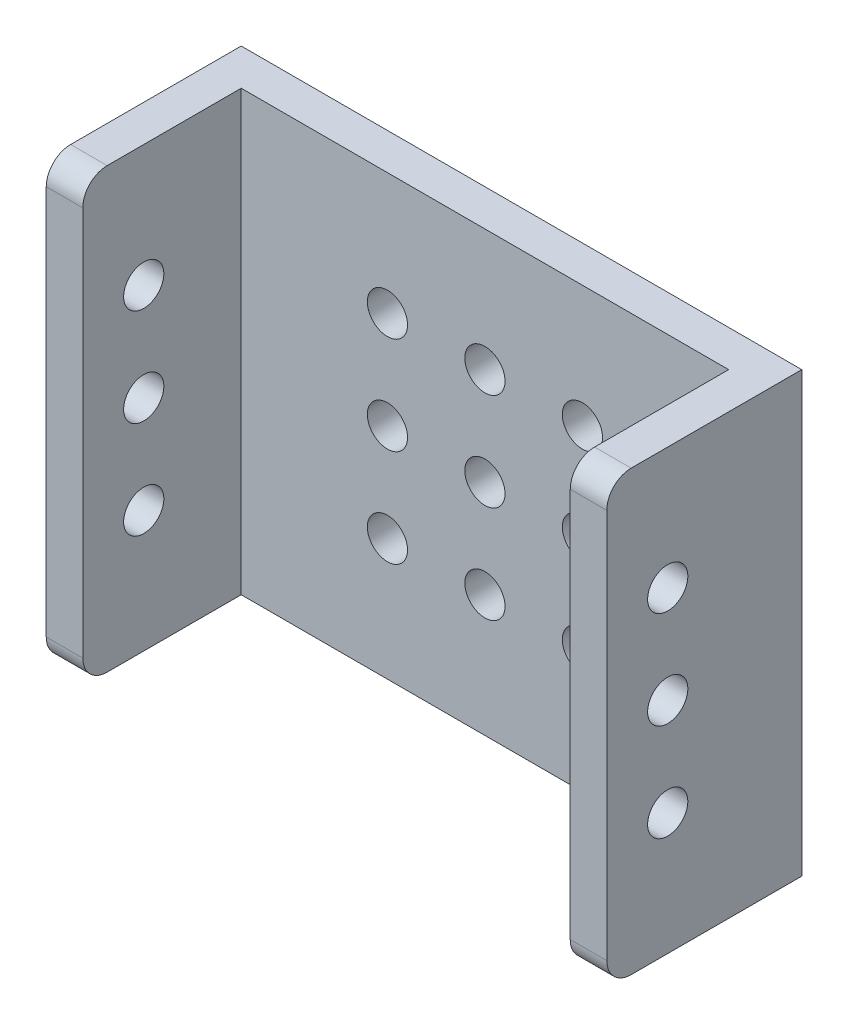
ISO-10303-21;
HEADER;
FILE_DESCRIPTION(('STEP AP214'),'2;1');
FILE_NAME('part.step','',(''),(''),'','','');
FILE_SCHEMA(('AUTOMOTIVE_DESIGN { 1 0 10303 214 1 1 1 1 }'));
ENDSEC;
DATA;
#1=APPLICATION_CONTEXT('core data for automotive mechanical design processes');
#2=APPLICATION_PROTOCOL_DEFINITION('international standard','automotive_design',2000,#1);
#3=PRODUCT_CONTEXT('',#1,'mechanical');
#4=PRODUCT('Part','Part','',(#3));
#5=PRODUCT_RELATED_PRODUCT_CATEGORY('part','',(#4));
#6=PRODUCT_DEFINITION_FORMATION('','',#4);
#7=PRODUCT_DEFINITION_CONTEXT('part definition',#1,'design');
#8=PRODUCT_DEFINITION('design','',#6,#7);
#9=PRODUCT_DEFINITION_SHAPE('','',#8);
#10=(LENGTH_UNIT() NAMED_UNIT(*) SI_UNIT(.MILLI.,.METRE.));
#11=(NAMED_UNIT(*) PLANE_ANGLE_UNIT() SI_UNIT($,.RADIAN.));
#12=(NAMED_UNIT(*) SI_UNIT($,.STERADIAN.) SOLID_ANGLE_UNIT());
#13=UNCERTAINTY_MEASURE_WITH_UNIT(LENGTH_MEASURE(1.E-05),#10,'distance_accuracy_value','');
#14=(GEOMETRIC_REPRESENTATION_CONTEXT(3) GLOBAL_UNCERTAINTY_ASSIGNED_CONTEXT((#13)) GLOBAL_UNIT_ASSIGNED_CONTEXT((#10,
#11,#12)) REPRESENTATION_CONTEXT('',''));
#15=CARTESIAN_POINT('',(0.,0.,0.));
#16=DIRECTION('',(0.,0.,1.));
#17=DIRECTION('',(1.,0.,0.));
#18=AXIS2_PLACEMENT_3D('',#15,#16,#17);
#19=CARTESIAN_POINT('',(0.,0.,3.));
#20=DIRECTION('',(0.,0.,1.));
#21=DIRECTION('',(1.,0.,0.));
#22=AXIS2_PLACEMENT_3D('',#19,#20,#21);
#23=PLANE('',#22);
#24=CARTESIAN_POINT('',(23.,26.,3.));
#25=DIRECTION('',(0.,0.,1.));
#26=DIRECTION('',(1.,0.,0.));
#27=AXIS2_PLACEMENT_3D('',#24,#25,#26);
#28=CIRCLE('',#27,1.65);
#29=CARTESIAN_POINT('',(24.65,26.,3.));
#30=VERTEX_POINT('',#29);
#31=EDGE_CURVE('E210',#30,#30,#28,.T.);
#32=ORIENTED_EDGE('',*,*,#31,.F.);
#33=EDGE_LOOP('',(#32));
#34=FACE_BOUND('',#33,.T.);
#35=CARTESIAN_POINT('',(31.,18.,3.));
#36=DIRECTION('',(0.,0.,1.));
#37=DIRECTION('',(1.,0.,0.));
#38=AXIS2_PLACEMENT_3D('',#35,#36,#37);
#39=CIRCLE('',#38,1.65);
#40=CARTESIAN_POINT('',(32.65,18.,3.));
#41=VERTEX_POINT('',#40);
#42=EDGE_CURVE('E285',#41,#41,#39,.T.);
#43=ORIENTED_EDGE('',*,*,#42,.F.);
#44=EDGE_LOOP('',(#43));
#45=FACE_BOUND('',#44,.T.);
#46=CARTESIAN_POINT('',(23.,10.,3.));
#47=DIRECTION('',(0.,0.,1.));
#48=DIRECTION('',(1.,0.,0.));
#49=AXIS2_PLACEMENT_3D('',#46,#47,#48);
#50=CIRCLE('',#49,1.65);
#51=CARTESIAN_POINT('',(24.65,10.,3.));
#52=VERTEX_POINT('',#51);
#53=EDGE_CURVE('E288',#52,#52,#50,.T.);
#54=ORIENTED_EDGE('',*,*,#53,.F.);
#55=EDGE_LOOP('',(#54));
#56=FACE_BOUND('',#55,.T.);
#57=CARTESIAN_POINT('',(15.,18.,3.));
#58=DIRECTION('',(0.,0.,1.));
#59=DIRECTION('',(1.,0.,0.));
#60=AXIS2_PLACEMENT_3D('',#57,#58,#59);
#61=CIRCLE('',#60,1.65);
#62=CARTESIAN_POINT('',(16.65,18.,3.));
#63=VERTEX_POINT('',#62);
#64=EDGE_CURVE('E291',#63,#63,#61,.T.);
#65=ORIENTED_EDGE('',*,*,#64,.F.);
#66=EDGE_LOOP('',(#65));
#67=FACE_BOUND('',#66,.T.);
#68=CARTESIAN_POINT('',(23.,18.,3.));
#69=DIRECTION('',(0.,0.,1.));
#70=DIRECTION('',(1.,0.,0.));
#71=AXIS2_PLACEMENT_3D('',#68,#69,#70);
#72=CIRCLE('',#71,1.65);
#73=CARTESIAN_POINT('',(24.65,18.,3.));
#74=VERTEX_POINT('',#73);
#75=EDGE_CURVE('E157',#74,#74,#72,.T.);
#76=ORIENTED_EDGE('',*,*,#75,.F.);
#77=EDGE_LOOP('',(#76));
#78=FACE_BOUND('',#77,.T.);
#79=CARTESIAN_POINT('',(15.,26.,3.));
#80=DIRECTION('',(0.,0.,1.));
#81=DIRECTION('',(1.,0.,0.));
#82=AXIS2_PLACEMENT_3D('',#79,#80,#81);
#83=CIRCLE('',#82,1.65);
#84=CARTESIAN_POINT('',(16.65,26.,3.));
#85=VERTEX_POINT('',#84);
#86=EDGE_CURVE('E152',#85,#85,#83,.T.);
#87=ORIENTED_EDGE('',*,*,#86,.F.);
#88=EDGE_LOOP('',(#87));
#89=FACE_BOUND('',#88,.T.);
#90=CARTESIAN_POINT('',(15.,10.,3.));
#91=DIRECTION('',(0.,0.,1.));
#92=DIRECTION('',(1.,0.,0.));
#93=AXIS2_PLACEMENT_3D('',#90,#91,#92);
#94=CIRCLE('',#93,1.65);
#95=CARTESIAN_POINT('',(16.65,10.,3.));
#96=VERTEX_POINT('',#95);
#97=EDGE_CURVE('E154',#96,#96,#94,.T.);
#98=ORIENTED_EDGE('',*,*,#97,.F.);
#99=EDGE_LOOP('',(#98));
#100=FACE_BOUND('',#99,.T.);
#101=CARTESIAN_POINT('',(31.,10.,3.));
#102=DIRECTION('',(0.,0.,1.));
#103=DIRECTION('',(1.,0.,0.));
#104=AXIS2_PLACEMENT_3D('',#101,#102,#103);
#105=CIRCLE('',#104,1.65);
#106=CARTESIAN_POINT('',(32.65,10.,3.));
#107=VERTEX_POINT('',#106);
#108=EDGE_CURVE('E163',#107,#107,#105,.T.);
#109=ORIENTED_EDGE('',*,*,#108,.F.);
#110=EDGE_LOOP('',(#109));
#111=FACE_BOUND('',#110,.T.);
#112=CARTESIAN_POINT('',(31.,26.,3.));
#113=DIRECTION('',(0.,0.,1.));
#114=DIRECTION('',(1.,0.,0.));
#115=AXIS2_PLACEMENT_3D('',#112,#113,#114);
#116=CIRCLE('',#115,1.65);
#117=CARTESIAN_POINT('',(32.65,26.,3.));
#118=VERTEX_POINT('',#117);
#119=EDGE_CURVE('E166',#118,#118,#116,.T.);
#120=ORIENTED_EDGE('',*,*,#119,.F.);
#121=EDGE_LOOP('',(#120));
#122=FACE_BOUND('',#121,.T.);
#123=DIRECTION('',(1.,0.,0.));
#124=VECTOR('',#123,1.);
#125=CARTESIAN_POINT('',(0.,0.,3.));
#126=LINE('',#125,#124);
#127=CARTESIAN_POINT('',(3.,0.,3.));
#128=VERTEX_POINT('',#127);
#129=CARTESIAN_POINT('',(43.,0.,3.));
#130=VERTEX_POINT('',#129);
#131=EDGE_CURVE('E130',#128,#130,#126,.T.);
#132=ORIENTED_EDGE('',*,*,#131,.T.);
#133=DIRECTION('',(0.,-1.,0.));
#134=VECTOR('',#133,1.);
#135=CARTESIAN_POINT('',(43.,0.,3.));
#136=LINE('',#135,#134);
#137=CARTESIAN_POINT('',(43.,36.,3.));
#138=VERTEX_POINT('',#137);
#139=EDGE_CURVE('E139',#138,#130,#136,.T.);
#140=ORIENTED_EDGE('',*,*,#139,.F.);
#141=DIRECTION('',(1.,0.,0.));
#142=VECTOR('',#141,1.);
#143=CARTESIAN_POINT('',(0.,36.,3.));
#144=LINE('',#143,#142);
#145=CARTESIAN_POINT('',(2.99999999999999,36.,3.));
#146=VERTEX_POINT('',#145);
#147=EDGE_CURVE('E151',#146,#138,#144,.T.);
#148=ORIENTED_EDGE('',*,*,#147,.F.);
#149=DIRECTION('',(0.,1.,0.));
#150=VECTOR('',#149,1.);
#151=CARTESIAN_POINT('',(2.99999999999999,36.,3.));
#152=LINE('',#151,#150);
#153=EDGE_CURVE('E150',#128,#146,#152,.T.);
#154=ORIENTED_EDGE('',*,*,#153,.F.);
#155=EDGE_LOOP('',(#132,#140,#148,#154));
#156=FACE_BOUND('',#155,.T.);
#157=ADVANCED_FACE('F35',(#34,#45,#56,#67,#78,#89,#100,#111,#122,#156),#23,.T.);
#158=CARTESIAN_POINT('',(0.,0.,3.));
#159=DIRECTION('',(0.,1.,0.));
#160=DIRECTION('',(0.,0.,1.));
#161=AXIS2_PLACEMENT_3D('',#158,#159,#160);
#162=PLANE('',#161);
#163=DIRECTION('',(0.,0.,-1.));
#164=VECTOR('',#163,1.);
#165=CARTESIAN_POINT('',(46.,0.,3.));
#166=LINE('',#165,#164);
#167=CARTESIAN_POINT('',(46.,0.,14.));
#168=VERTEX_POINT('',#167);
#169=CARTESIAN_POINT('',(46.,0.,0.));
#170=VERTEX_POINT('',#169);
#171=EDGE_CURVE('E216',#168,#170,#166,.T.);
#172=ORIENTED_EDGE('',*,*,#171,.F.);
#173=DIRECTION('',(1.,0.,0.));
#174=VECTOR('',#173,1.);
#175=CARTESIAN_POINT('',(0.,0.,14.));
#176=LINE('',#175,#174);
#177=CARTESIAN_POINT('',(43.,0.,14.));
#178=VERTEX_POINT('',#177);
#179=EDGE_CURVE('E132',#168,#178,#176,.F.);
#180=ORIENTED_EDGE('',*,*,#179,.T.);
#181=DIRECTION('',(0.,0.,-1.));
#182=VECTOR('',#181,1.);
#183=CARTESIAN_POINT('',(43.,0.,16.));
#184=LINE('',#183,#182);
#185=EDGE_CURVE('E124',#178,#130,#184,.T.);
#186=ORIENTED_EDGE('',*,*,#185,.T.);
#187=ORIENTED_EDGE('',*,*,#131,.F.);
#188=DIRECTION('',(0.,0.,-1.));
#189=VECTOR('',#188,1.);
#190=CARTESIAN_POINT('',(3.,0.,16.));
#191=LINE('',#190,#189);
#192=CARTESIAN_POINT('',(3.,0.,14.));
#193=VERTEX_POINT('',#192);
#194=EDGE_CURVE('E174',#193,#128,#191,.T.);
#195=ORIENTED_EDGE('',*,*,#194,.F.);
#196=DIRECTION('',(1.,0.,0.));
#197=VECTOR('',#196,1.);
#198=CARTESIAN_POINT('',(0.,0.,14.));
#199=LINE('',#198,#197);
#200=CARTESIAN_POINT('',(0.,0.,14.));
#201=VERTEX_POINT('',#200);
#202=EDGE_CURVE('E243',#193,#201,#199,.F.);
#203=ORIENTED_EDGE('',*,*,#202,.T.);
#204=DIRECTION('',(0.,0.,-1.));
#205=VECTOR('',#204,1.);
#206=CARTESIAN_POINT('',(0.,0.,3.));
#207=LINE('',#206,#205);
#208=CARTESIAN_POINT('',(0.,0.,0.));
#209=VERTEX_POINT('',#208);
#210=EDGE_CURVE('E169',#201,#209,#207,.T.);
#211=ORIENTED_EDGE('',*,*,#210,.T.);
#212=DIRECTION('',(1.,0.,0.));
#213=VECTOR('',#212,1.);
#214=CARTESIAN_POINT('',(0.,0.,0.));
#215=LINE('',#214,#213);
#216=EDGE_CURVE('E189',#209,#170,#215,.T.);
#217=ORIENTED_EDGE('',*,*,#216,.T.);
#218=EDGE_LOOP('',(#172,#180,#186,#187,#195,#203,#211,#217));
#219=FACE_BOUND('',#218,.T.);
#220=ADVANCED_FACE('F127',(#219),#162,.F.);
#221=CARTESIAN_POINT('',(46.,0.,3.));
#222=DIRECTION('',(-1.,0.,0.));
#223=DIRECTION('',(0.,-1.,0.));
#224=AXIS2_PLACEMENT_3D('',#221,#222,#223);
#225=PLANE('',#224);
#226=CARTESIAN_POINT('',(46.,18.,11.));
#227=DIRECTION('',(-1.,0.,0.));
#228=DIRECTION('',(0.,-1.,0.));
#229=AXIS2_PLACEMENT_3D('',#226,#227,#228);
#230=CIRCLE('',#229,1.65);
#231=CARTESIAN_POINT('',(46.,16.35,11.));
#232=VERTEX_POINT('',#231);
#233=EDGE_CURVE('E411',#232,#232,#230,.F.);
#234=ORIENTED_EDGE('',*,*,#233,.F.);
#235=EDGE_LOOP('',(#234));
#236=FACE_BOUND('',#235,.T.);
#237=CARTESIAN_POINT('',(46.,10.,11.));
#238=DIRECTION('',(-1.,0.,0.));
#239=DIRECTION('',(0.,-1.,0.));
#240=AXIS2_PLACEMENT_3D('',#237,#238,#239);
#241=CIRCLE('',#240,1.65);
#242=CARTESIAN_POINT('',(46.,8.35,11.));
#243=VERTEX_POINT('',#242);
#244=EDGE_CURVE('E233',#243,#243,#241,.F.);
#245=ORIENTED_EDGE('',*,*,#244,.F.);
#246=EDGE_LOOP('',(#245));
#247=FACE_BOUND('',#246,.T.);
#248=CARTESIAN_POINT('',(46.,26.,11.));
#249=DIRECTION('',(-1.,0.,0.));
#250=DIRECTION('',(0.,-1.,0.));
#251=AXIS2_PLACEMENT_3D('',#248,#249,#250);
#252=CIRCLE('',#251,1.65);
#253=CARTESIAN_POINT('',(46.,24.35,11.));
#254=VERTEX_POINT('',#253);
#255=EDGE_CURVE('E146',#254,#254,#252,.F.);
#256=ORIENTED_EDGE('',*,*,#255,.F.);
#257=EDGE_LOOP('',(#256));
#258=FACE_BOUND('',#257,.T.);
#259=DIRECTION('',(0.,1.,0.));
#260=VECTOR('',#259,1.);
#261=CARTESIAN_POINT('',(46.,0.,16.));
#262=LINE('',#261,#260);
#263=CARTESIAN_POINT('',(46.,2.,16.));
#264=VERTEX_POINT('',#263);
#265=CARTESIAN_POINT('',(46.,34.,16.));
#266=VERTEX_POINT('',#265);
#267=EDGE_CURVE('E145',#264,#266,#262,.T.);
#268=ORIENTED_EDGE('',*,*,#267,.F.);
#269=CARTESIAN_POINT('',(46.,2.,14.));
#270=DIRECTION('',(-1.,0.,0.));
#271=DIRECTION('',(0.,-1.,0.));
#272=AXIS2_PLACEMENT_3D('',#269,#270,#271);
#273=CIRCLE('',#272,2.);
#274=EDGE_CURVE('E241',#264,#168,#273,.F.);
#275=ORIENTED_EDGE('',*,*,#274,.T.);
#276=ORIENTED_EDGE('',*,*,#171,.T.);
#277=DIRECTION('',(0.,1.,0.));
#278=VECTOR('',#277,1.);
#279=CARTESIAN_POINT('',(46.,0.,0.));
#280=LINE('',#279,#278);
#281=CARTESIAN_POINT('',(46.,36.,0.));
#282=VERTEX_POINT('',#281);
#283=EDGE_CURVE('E192',#170,#282,#280,.T.);
#284=ORIENTED_EDGE('',*,*,#283,.T.);
#285=DIRECTION('',(0.,0.,-1.));
#286=VECTOR('',#285,1.);
#287=CARTESIAN_POINT('',(46.,36.,3.));
#288=LINE('',#287,#286);
#289=CARTESIAN_POINT('',(46.,36.,14.));
#290=VERTEX_POINT('',#289);
#291=EDGE_CURVE('E214',#290,#282,#288,.T.);
#292=ORIENTED_EDGE('',*,*,#291,.F.);
#293=CARTESIAN_POINT('',(46.,34.,14.));
#294=DIRECTION('',(-1.,0.,0.));
#295=DIRECTION('',(0.,-1.,0.));
#296=AXIS2_PLACEMENT_3D('',#293,#294,#295);
#297=CIRCLE('',#296,2.);
#298=EDGE_CURVE('E239',#290,#266,#297,.F.);
#299=ORIENTED_EDGE('',*,*,#298,.T.);
#300=EDGE_LOOP('',(#268,#275,#276,#284,#292,#299));
#301=FACE_BOUND('',#300,.T.);
#302=ADVANCED_FACE('F344',(#236,#247,#258,#301),#225,.F.);
#303=CARTESIAN_POINT('',(0.,36.,3.));
#304=DIRECTION('',(0.,1.,0.));
#305=DIRECTION('',(0.,0.,1.));
#306=AXIS2_PLACEMENT_3D('',#303,#304,#305);
#307=PLANE('',#306);
#308=DIRECTION('',(0.,0.,-1.));
#309=VECTOR('',#308,1.);
#310=CARTESIAN_POINT('',(43.,36.,16.));
#311=LINE('',#310,#309);
#312=CARTESIAN_POINT('',(43.,36.,14.));
#313=VERTEX_POINT('',#312);
#314=EDGE_CURVE('E135',#313,#138,#311,.T.);
#315=ORIENTED_EDGE('',*,*,#314,.F.);
#316=DIRECTION('',(-1.,0.,0.));
#317=VECTOR('',#316,1.);
#318=CARTESIAN_POINT('',(46.,36.,14.));
#319=LINE('',#318,#317);
#320=EDGE_CURVE('E252',#313,#290,#319,.F.);
#321=ORIENTED_EDGE('',*,*,#320,.T.);
#322=ORIENTED_EDGE('',*,*,#291,.T.);
#323=DIRECTION('',(1.,0.,0.));
#324=VECTOR('',#323,1.);
#325=CARTESIAN_POINT('',(0.,36.,0.));
#326=LINE('',#325,#324);
#327=CARTESIAN_POINT('',(0.,36.,0.));
#328=VERTEX_POINT('',#327);
#329=EDGE_CURVE('E195',#328,#282,#326,.T.);
#330=ORIENTED_EDGE('',*,*,#329,.F.);
#331=DIRECTION('',(0.,0.,-1.));
#332=VECTOR('',#331,1.);
#333=CARTESIAN_POINT('',(0.,36.,3.));
#334=LINE('',#333,#332);
#335=CARTESIAN_POINT('',(0.,36.,14.));
#336=VERTEX_POINT('',#335);
#337=EDGE_CURVE('E212',#336,#328,#334,.T.);
#338=ORIENTED_EDGE('',*,*,#337,.F.);
#339=DIRECTION('',(-1.,0.,0.));
#340=VECTOR('',#339,1.);
#341=CARTESIAN_POINT('',(2.99999999999999,36.,14.));
#342=LINE('',#341,#340);
#343=CARTESIAN_POINT('',(2.99999999999999,36.,14.));
#344=VERTEX_POINT('',#343);
#345=EDGE_CURVE('E250',#336,#344,#342,.F.);
#346=ORIENTED_EDGE('',*,*,#345,.T.);
#347=DIRECTION('',(0.,0.,-1.));
#348=VECTOR('',#347,1.);
#349=CARTESIAN_POINT('',(2.99999999999999,36.,16.));
#350=LINE('',#349,#348);
#351=EDGE_CURVE('E265',#344,#146,#350,.T.);
#352=ORIENTED_EDGE('',*,*,#351,.T.);
#353=ORIENTED_EDGE('',*,*,#147,.T.);
#354=EDGE_LOOP('',(#315,#321,#322,#330,#338,#346,#352,#353));
#355=FACE_BOUND('',#354,.T.);
#356=ADVANCED_FACE('F333',(#355),#307,.T.);
#357=CARTESIAN_POINT('',(31.,10.,3.));
#358=DIRECTION('',(0.,0.,-1.));
#359=DIRECTION('',(-1.,0.,0.));
#360=AXIS2_PLACEMENT_3D('',#357,#358,#359);
#361=CYLINDRICAL_SURFACE('',#360,1.65);
#362=ORIENTED_EDGE('',*,*,#108,.T.);
#363=EDGE_LOOP('',(#362));
#364=FACE_BOUND('',#363,.T.);
#365=CARTESIAN_POINT('',(31.,10.,0.));
#366=DIRECTION('',(0.,0.,1.));
#367=DIRECTION('',(1.,0.,0.));
#368=AXIS2_PLACEMENT_3D('',#365,#366,#367);
#369=CIRCLE('',#368,1.65);
#370=CARTESIAN_POINT('',(32.65,10.,0.));
#371=VERTEX_POINT('',#370);
#372=EDGE_CURVE('E204',#371,#371,#369,.T.);
#373=ORIENTED_EDGE('',*,*,#372,.F.);
#374=EDGE_LOOP('',(#373));
#375=FACE_BOUND('',#374,.T.);
#376=ADVANCED_FACE('F329',(#364,#375),#361,.F.);
#377=CARTESIAN_POINT('',(15.,10.,3.));
#378=DIRECTION('',(0.,0.,-1.));
#379=DIRECTION('',(-1.,0.,0.));
#380=AXIS2_PLACEMENT_3D('',#377,#378,#379);
#381=CYLINDRICAL_SURFACE('',#380,1.65);
#382=ORIENTED_EDGE('',*,*,#97,.T.);
#383=EDGE_LOOP('',(#382));
#384=FACE_BOUND('',#383,.T.);
#385=CARTESIAN_POINT('',(15.,10.,0.));
#386=DIRECTION('',(0.,0.,1.));
#387=DIRECTION('',(1.,0.,0.));
#388=AXIS2_PLACEMENT_3D('',#385,#386,#387);
#389=CIRCLE('',#388,1.65);
#390=CARTESIAN_POINT('',(16.65,10.,0.));
#391=VERTEX_POINT('',#390);
#392=EDGE_CURVE('E201',#391,#391,#389,.T.);
#393=ORIENTED_EDGE('',*,*,#392,.F.);
#394=EDGE_LOOP('',(#393));
#395=FACE_BOUND('',#394,.T.);
#396=ADVANCED_FACE('F332',(#384,#395),#381,.F.);
#397=CARTESIAN_POINT('',(0.,0.,3.));
#398=DIRECTION('',(-1.,0.,0.));
#399=DIRECTION('',(0.,-1.,0.));
#400=AXIS2_PLACEMENT_3D('',#397,#398,#399);
#401=PLANE('',#400);
#402=CARTESIAN_POINT('',(0.,18.,11.));
#403=DIRECTION('',(1.,0.,0.));
#404=DIRECTION('',(0.,0.,-1.));
#405=AXIS2_PLACEMENT_3D('',#402,#403,#404);
#406=CIRCLE('',#405,1.65);
#407=CARTESIAN_POINT('',(0.,18.,9.35));
#408=VERTEX_POINT('',#407);
#409=EDGE_CURVE('E228',#408,#408,#406,.T.);
#410=ORIENTED_EDGE('',*,*,#409,.T.);
#411=EDGE_LOOP('',(#410));
#412=FACE_BOUND('',#411,.T.);
#413=CARTESIAN_POINT('',(0.,10.,11.));
#414=DIRECTION('',(1.,0.,0.));
#415=DIRECTION('',(0.,0.,-1.));
#416=AXIS2_PLACEMENT_3D('',#413,#414,#415);
#417=CIRCLE('',#416,1.65);
#418=CARTESIAN_POINT('',(0.,10.,9.35));
#419=VERTEX_POINT('',#418);
#420=EDGE_CURVE('E420',#419,#419,#417,.T.);
#421=ORIENTED_EDGE('',*,*,#420,.T.);
#422=EDGE_LOOP('',(#421));
#423=FACE_BOUND('',#422,.T.);
#424=CARTESIAN_POINT('',(0.,26.,11.));
#425=DIRECTION('',(1.,0.,0.));
#426=DIRECTION('',(0.,0.,-1.));
#427=AXIS2_PLACEMENT_3D('',#424,#425,#426);
#428=CIRCLE('',#427,1.65);
#429=CARTESIAN_POINT('',(0.,26.,9.35));
#430=VERTEX_POINT('',#429);
#431=EDGE_CURVE('E223',#430,#430,#428,.T.);
#432=ORIENTED_EDGE('',*,*,#431,.T.);
#433=EDGE_LOOP('',(#432));
#434=FACE_BOUND('',#433,.T.);
#435=DIRECTION('',(0.,-1.,0.));
#436=VECTOR('',#435,1.);
#437=CARTESIAN_POINT('',(0.,36.,16.));
#438=LINE('',#437,#436);
#439=CARTESIAN_POINT('',(0.,34.,16.));
#440=VERTEX_POINT('',#439);
#441=CARTESIAN_POINT('',(0.,2.,16.));
#442=VERTEX_POINT('',#441);
#443=EDGE_CURVE('E272',#440,#442,#438,.T.);
#444=ORIENTED_EDGE('',*,*,#443,.F.);
#445=CARTESIAN_POINT('',(0.,34.,14.));
#446=DIRECTION('',(-1.,0.,0.));
#447=DIRECTION('',(0.,-1.,0.));
#448=AXIS2_PLACEMENT_3D('',#445,#446,#447);
#449=CIRCLE('',#448,2.);
#450=EDGE_CURVE('E261',#440,#336,#449,.T.);
#451=ORIENTED_EDGE('',*,*,#450,.T.);
#452=ORIENTED_EDGE('',*,*,#337,.T.);
#453=DIRECTION('',(0.,1.,0.));
#454=VECTOR('',#453,1.);
#455=CARTESIAN_POINT('',(0.,0.,0.));
#456=LINE('',#455,#454);
#457=EDGE_CURVE('E198',#209,#328,#456,.T.);
#458=ORIENTED_EDGE('',*,*,#457,.F.);
#459=ORIENTED_EDGE('',*,*,#210,.F.);
#460=CARTESIAN_POINT('',(0.,2.,14.));
#461=DIRECTION('',(-1.,0.,0.));
#462=DIRECTION('',(0.,-1.,0.));
#463=AXIS2_PLACEMENT_3D('',#460,#461,#462);
#464=CIRCLE('',#463,2.);
#465=EDGE_CURVE('E259',#201,#442,#464,.T.);
#466=ORIENTED_EDGE('',*,*,#465,.T.);
#467=EDGE_LOOP('',(#444,#451,#452,#458,#459,#466));
#468=FACE_BOUND('',#467,.T.);
#469=ADVANCED_FACE('F271',(#412,#423,#434,#468),#401,.T.);
#470=CARTESIAN_POINT('',(15.,26.,3.));
#471=DIRECTION('',(0.,0.,-1.));
#472=DIRECTION('',(-1.,0.,0.));
#473=AXIS2_PLACEMENT_3D('',#470,#471,#472);
#474=CYLINDRICAL_SURFACE('',#473,1.65);
#475=ORIENTED_EDGE('',*,*,#86,.T.);
#476=EDGE_LOOP('',(#475));
#477=FACE_BOUND('',#476,.T.);
#478=CARTESIAN_POINT('',(15.,26.,0.));
#479=DIRECTION('',(0.,0.,1.));
#480=DIRECTION('',(1.,0.,0.));
#481=AXIS2_PLACEMENT_3D('',#478,#479,#480);
#482=CIRCLE('',#481,1.65);
#483=CARTESIAN_POINT('',(16.65,26.,0.));
#484=VERTEX_POINT('',#483);
#485=EDGE_CURVE('E186',#484,#484,#482,.T.);
#486=ORIENTED_EDGE('',*,*,#485,.F.);
#487=EDGE_LOOP('',(#486));
#488=FACE_BOUND('',#487,.T.);
#489=ADVANCED_FACE('F340',(#477,#488),#474,.F.);
#490=CARTESIAN_POINT('',(23.,18.,3.));
#491=DIRECTION('',(0.,0.,-1.));
#492=DIRECTION('',(-1.,0.,0.));
#493=AXIS2_PLACEMENT_3D('',#490,#491,#492);
#494=CYLINDRICAL_SURFACE('',#493,1.65);
#495=ORIENTED_EDGE('',*,*,#75,.T.);
#496=EDGE_LOOP('',(#495));
#497=FACE_BOUND('',#496,.T.);
#498=CARTESIAN_POINT('',(23.,18.,0.));
#499=DIRECTION('',(0.,0.,1.));
#500=DIRECTION('',(1.,0.,0.));
#501=AXIS2_PLACEMENT_3D('',#498,#499,#500);
#502=CIRCLE('',#501,1.65);
#503=CARTESIAN_POINT('',(24.65,18.,0.));
#504=VERTEX_POINT('',#503);
#505=EDGE_CURVE('E183',#504,#504,#502,.T.);
#506=ORIENTED_EDGE('',*,*,#505,.F.);
#507=EDGE_LOOP('',(#506));
#508=FACE_BOUND('',#507,.T.);
#509=ADVANCED_FACE('F296',(#497,#508),#494,.F.);
#510=CARTESIAN_POINT('',(15.,18.,3.));
#511=DIRECTION('',(0.,0.,-1.));
#512=DIRECTION('',(-1.,0.,0.));
#513=AXIS2_PLACEMENT_3D('',#510,#511,#512);
#514=CYLINDRICAL_SURFACE('',#513,1.65);
#515=ORIENTED_EDGE('',*,*,#64,.T.);
#516=EDGE_LOOP('',(#515));
#517=FACE_BOUND('',#516,.T.);
#518=CARTESIAN_POINT('',(15.,18.,0.));
#519=DIRECTION('',(0.,0.,1.));
#520=DIRECTION('',(1.,0.,0.));
#521=AXIS2_PLACEMENT_3D('',#518,#519,#520);
#522=CIRCLE('',#521,1.65);
#523=CARTESIAN_POINT('',(16.65,18.,0.));
#524=VERTEX_POINT('',#523);
#525=EDGE_CURVE('E180',#524,#524,#522,.T.);
#526=ORIENTED_EDGE('',*,*,#525,.F.);
#527=EDGE_LOOP('',(#526));
#528=FACE_BOUND('',#527,.T.);
#529=ADVANCED_FACE('F356',(#517,#528),#514,.F.);
#530=CARTESIAN_POINT('',(23.,10.,3.));
#531=DIRECTION('',(0.,0.,-1.));
#532=DIRECTION('',(-1.,0.,0.));
#533=AXIS2_PLACEMENT_3D('',#530,#531,#532);
#534=CYLINDRICAL_SURFACE('',#533,1.65);
#535=ORIENTED_EDGE('',*,*,#53,.T.);
#536=EDGE_LOOP('',(#535));
#537=FACE_BOUND('',#536,.T.);
#538=CARTESIAN_POINT('',(23.,10.,0.));
#539=DIRECTION('',(0.,0.,1.));
#540=DIRECTION('',(1.,0.,0.));
#541=AXIS2_PLACEMENT_3D('',#538,#539,#540);
#542=CIRCLE('',#541,1.65);
#543=CARTESIAN_POINT('',(24.65,10.,0.));
#544=VERTEX_POINT('',#543);
#545=EDGE_CURVE('E177',#544,#544,#542,.T.);
#546=ORIENTED_EDGE('',*,*,#545,.F.);
#547=EDGE_LOOP('',(#546));
#548=FACE_BOUND('',#547,.T.);
#549=ADVANCED_FACE('F359',(#537,#548),#534,.F.);
#550=CARTESIAN_POINT('',(31.,18.,3.));
#551=DIRECTION('',(0.,0.,-1.));
#552=DIRECTION('',(-1.,0.,0.));
#553=AXIS2_PLACEMENT_3D('',#550,#551,#552);
#554=CYLINDRICAL_SURFACE('',#553,1.65);
#555=ORIENTED_EDGE('',*,*,#42,.T.);
#556=EDGE_LOOP('',(#555));
#557=FACE_BOUND('',#556,.T.);
#558=CARTESIAN_POINT('',(31.,18.,0.));
#559=DIRECTION('',(0.,0.,1.));
#560=DIRECTION('',(1.,0.,0.));
#561=AXIS2_PLACEMENT_3D('',#558,#559,#560);
#562=CIRCLE('',#561,1.65);
#563=CARTESIAN_POINT('',(32.65,18.,0.));
#564=VERTEX_POINT('',#563);
#565=EDGE_CURVE('E173',#564,#564,#562,.T.);
#566=ORIENTED_EDGE('',*,*,#565,.F.);
#567=EDGE_LOOP('',(#566));
#568=FACE_BOUND('',#567,.T.);
#569=ADVANCED_FACE('F363',(#557,#568),#554,.F.);
#570=CARTESIAN_POINT('',(23.,26.,3.));
#571=DIRECTION('',(0.,0.,-1.));
#572=DIRECTION('',(-1.,0.,0.));
#573=AXIS2_PLACEMENT_3D('',#570,#571,#572);
#574=CYLINDRICAL_SURFACE('',#573,1.65);
#575=ORIENTED_EDGE('',*,*,#31,.T.);
#576=EDGE_LOOP('',(#575));
#577=FACE_BOUND('',#576,.T.);
#578=CARTESIAN_POINT('',(23.,26.,0.));
#579=DIRECTION('',(0.,0.,1.));
#580=DIRECTION('',(1.,0.,0.));
#581=AXIS2_PLACEMENT_3D('',#578,#579,#580);
#582=CIRCLE('',#581,1.65);
#583=CARTESIAN_POINT('',(24.65,26.,0.));
#584=VERTEX_POINT('',#583);
#585=EDGE_CURVE('E170',#584,#584,#582,.T.);
#586=ORIENTED_EDGE('',*,*,#585,.F.);
#587=EDGE_LOOP('',(#586));
#588=FACE_BOUND('',#587,.T.);
#589=ADVANCED_FACE('F315',(#577,#588),#574,.F.);
#590=CARTESIAN_POINT('',(31.,26.,3.));
#591=DIRECTION('',(0.,0.,-1.));
#592=DIRECTION('',(-1.,0.,0.));
#593=AXIS2_PLACEMENT_3D('',#590,#591,#592);
#594=CYLINDRICAL_SURFACE('',#593,1.65);
#595=ORIENTED_EDGE('',*,*,#119,.T.);
#596=EDGE_LOOP('',(#595));
#597=FACE_BOUND('',#596,.T.);
#598=CARTESIAN_POINT('',(31.,26.,0.));
#599=DIRECTION('',(0.,0.,1.));
#600=DIRECTION('',(1.,0.,0.));
#601=AXIS2_PLACEMENT_3D('',#598,#599,#600);
#602=CIRCLE('',#601,1.65);
#603=CARTESIAN_POINT('',(32.65,26.,0.));
#604=VERTEX_POINT('',#603);
#605=EDGE_CURVE('E207',#604,#604,#602,.T.);
#606=ORIENTED_EDGE('',*,*,#605,.F.);
#607=EDGE_LOOP('',(#606));
#608=FACE_BOUND('',#607,.T.);
#609=ADVANCED_FACE('F311',(#597,#608),#594,.F.);
#610=CARTESIAN_POINT('',(0.,0.,0.));
#611=DIRECTION('',(0.,0.,1.));
#612=DIRECTION('',(1.,0.,0.));
#613=AXIS2_PLACEMENT_3D('',#610,#611,#612);
#614=PLANE('',#613);
#615=ORIENTED_EDGE('',*,*,#585,.T.);
#616=EDGE_LOOP('',(#615));
#617=FACE_BOUND('',#616,.T.);
#618=ORIENTED_EDGE('',*,*,#565,.T.);
#619=EDGE_LOOP('',(#618));
#620=FACE_BOUND('',#619,.T.);
#621=ORIENTED_EDGE('',*,*,#545,.T.);
#622=EDGE_LOOP('',(#621));
#623=FACE_BOUND('',#622,.T.);
#624=ORIENTED_EDGE('',*,*,#525,.T.);
#625=EDGE_LOOP('',(#624));
#626=FACE_BOUND('',#625,.T.);
#627=ORIENTED_EDGE('',*,*,#505,.T.);
#628=EDGE_LOOP('',(#627));
#629=FACE_BOUND('',#628,.T.);
#630=ORIENTED_EDGE('',*,*,#485,.T.);
#631=EDGE_LOOP('',(#630));
#632=FACE_BOUND('',#631,.T.);
#633=ORIENTED_EDGE('',*,*,#216,.F.);
#634=ORIENTED_EDGE('',*,*,#457,.T.);
#635=ORIENTED_EDGE('',*,*,#329,.T.);
#636=ORIENTED_EDGE('',*,*,#283,.F.);
#637=EDGE_LOOP('',(#633,#634,#635,#636));
#638=FACE_BOUND('',#637,.T.);
#639=ORIENTED_EDGE('',*,*,#392,.T.);
#640=EDGE_LOOP('',(#639));
#641=FACE_BOUND('',#640,.T.);
#642=ORIENTED_EDGE('',*,*,#372,.T.);
#643=EDGE_LOOP('',(#642));
#644=FACE_BOUND('',#643,.T.);
#645=ORIENTED_EDGE('',*,*,#605,.T.);
#646=EDGE_LOOP('',(#645));
#647=FACE_BOUND('',#646,.T.);
#648=ADVANCED_FACE('F314',(#617,#620,#623,#626,#629,#632,#638,#641,#644,#647),#614,.F.);
#649=CARTESIAN_POINT('',(2.99999999999999,36.,16.));
#650=DIRECTION('',(-1.,0.,0.));
#651=DIRECTION('',(0.,-1.,0.));
#652=AXIS2_PLACEMENT_3D('',#649,#650,#651);
#653=PLANE('',#652);
#654=CARTESIAN_POINT('',(3.,18.,11.));
#655=DIRECTION('',(-1.,0.,0.));
#656=DIRECTION('',(0.,-1.,0.));
#657=AXIS2_PLACEMENT_3D('',#654,#655,#656);
#658=CIRCLE('',#657,1.65);
#659=CARTESIAN_POINT('',(3.,16.35,11.));
#660=VERTEX_POINT('',#659);
#661=EDGE_CURVE('E232',#660,#660,#658,.F.);
#662=ORIENTED_EDGE('',*,*,#661,.F.);
#663=EDGE_LOOP('',(#662));
#664=FACE_BOUND('',#663,.T.);
#665=CARTESIAN_POINT('',(3.,10.,11.));
#666=DIRECTION('',(-1.,0.,0.));
#667=DIRECTION('',(0.,-1.,0.));
#668=AXIS2_PLACEMENT_3D('',#665,#666,#667);
#669=CIRCLE('',#668,1.65);
#670=CARTESIAN_POINT('',(3.,8.35,11.));
#671=VERTEX_POINT('',#670);
#672=EDGE_CURVE('E227',#671,#671,#669,.F.);
#673=ORIENTED_EDGE('',*,*,#672,.F.);
#674=EDGE_LOOP('',(#673));
#675=FACE_BOUND('',#674,.T.);
#676=CARTESIAN_POINT('',(3.,26.,11.));
#677=DIRECTION('',(-1.,0.,0.));
#678=DIRECTION('',(0.,-1.,0.));
#679=AXIS2_PLACEMENT_3D('',#676,#677,#678);
#680=CIRCLE('',#679,1.65);
#681=CARTESIAN_POINT('',(3.,24.35,11.));
#682=VERTEX_POINT('',#681);
#683=EDGE_CURVE('E222',#682,#682,#680,.F.);
#684=ORIENTED_EDGE('',*,*,#683,.F.);
#685=EDGE_LOOP('',(#684));
#686=FACE_BOUND('',#685,.T.);
#687=ORIENTED_EDGE('',*,*,#351,.F.);
#688=CARTESIAN_POINT('',(2.99999999999999,34.,14.));
#689=DIRECTION('',(-1.,0.,0.));
#690=DIRECTION('',(0.,-1.,0.));
#691=AXIS2_PLACEMENT_3D('',#688,#689,#690);
#692=CIRCLE('',#691,2.);
#693=CARTESIAN_POINT('',(2.99999999999999,34.,16.));
#694=VERTEX_POINT('',#693);
#695=EDGE_CURVE('E11',#344,#694,#692,.F.);
#696=ORIENTED_EDGE('',*,*,#695,.T.);
#697=DIRECTION('',(0.,1.,0.));
#698=VECTOR('',#697,1.);
#699=CARTESIAN_POINT('',(2.99999999999999,36.,16.));
#700=LINE('',#699,#698);
#701=CARTESIAN_POINT('',(3.,2.,16.));
#702=VERTEX_POINT('',#701);
#703=EDGE_CURVE('E263',#702,#694,#700,.T.);
#704=ORIENTED_EDGE('',*,*,#703,.F.);
#705=CARTESIAN_POINT('',(3.,2.,14.));
#706=DIRECTION('',(-1.,0.,0.));
#707=DIRECTION('',(0.,-1.,0.));
#708=AXIS2_PLACEMENT_3D('',#705,#706,#707);
#709=CIRCLE('',#708,2.);
#710=EDGE_CURVE('E43',#702,#193,#709,.F.);
#711=ORIENTED_EDGE('',*,*,#710,.T.);
#712=ORIENTED_EDGE('',*,*,#194,.T.);
#713=ORIENTED_EDGE('',*,*,#153,.T.);
#714=EDGE_LOOP('',(#687,#696,#704,#711,#712,#713));
#715=FACE_BOUND('',#714,.T.);
#716=ADVANCED_FACE('F262',(#664,#675,#686,#715),#653,.F.);
#717=CARTESIAN_POINT('',(0.,0.,16.));
#718=DIRECTION('',(0.,0.,-1.));
#719=DIRECTION('',(-1.,0.,0.));
#720=AXIS2_PLACEMENT_3D('',#717,#718,#719);
#721=PLANE('',#720);
#722=ORIENTED_EDGE('',*,*,#703,.T.);
#723=DIRECTION('',(-1.,0.,0.));
#724=VECTOR('',#723,1.);
#725=CARTESIAN_POINT('',(0.,34.,16.));
#726=LINE('',#725,#724);
#727=EDGE_CURVE('E256',#694,#440,#726,.T.);
#728=ORIENTED_EDGE('',*,*,#727,.T.);
#729=ORIENTED_EDGE('',*,*,#443,.T.);
#730=DIRECTION('',(1.,0.,0.));
#731=VECTOR('',#730,1.);
#732=CARTESIAN_POINT('',(0.,2.,16.));
#733=LINE('',#732,#731);
#734=EDGE_CURVE('E254',#442,#702,#733,.T.);
#735=ORIENTED_EDGE('',*,*,#734,.T.);
#736=EDGE_LOOP('',(#722,#728,#729,#735));
#737=FACE_BOUND('',#736,.T.);
#738=ADVANCED_FACE('F275',(#737),#721,.F.);
#739=CARTESIAN_POINT('',(43.,0.,16.));
#740=DIRECTION('',(1.,0.,0.));
#741=DIRECTION('',(0.,0.,-1.));
#742=AXIS2_PLACEMENT_3D('',#739,#740,#741);
#743=PLANE('',#742);
#744=CARTESIAN_POINT('',(43.,18.,11.));
#745=DIRECTION('',(1.,0.,0.));
#746=DIRECTION('',(0.,0.,-1.));
#747=AXIS2_PLACEMENT_3D('',#744,#745,#746);
#748=CIRCLE('',#747,1.65);
#749=CARTESIAN_POINT('',(43.,18.,9.35));
#750=VERTEX_POINT('',#749);
#751=EDGE_CURVE('E229',#750,#750,#748,.F.);
#752=ORIENTED_EDGE('',*,*,#751,.F.);
#753=EDGE_LOOP('',(#752));
#754=FACE_BOUND('',#753,.T.);
#755=CARTESIAN_POINT('',(43.,10.,11.));
#756=DIRECTION('',(1.,0.,0.));
#757=DIRECTION('',(0.,0.,-1.));
#758=AXIS2_PLACEMENT_3D('',#755,#756,#757);
#759=CIRCLE('',#758,1.65);
#760=CARTESIAN_POINT('',(43.,10.,9.35));
#761=VERTEX_POINT('',#760);
#762=EDGE_CURVE('E224',#761,#761,#759,.F.);
#763=ORIENTED_EDGE('',*,*,#762,.F.);
#764=EDGE_LOOP('',(#763));
#765=FACE_BOUND('',#764,.T.);
#766=CARTESIAN_POINT('',(43.,26.,11.));
#767=DIRECTION('',(1.,0.,0.));
#768=DIRECTION('',(0.,0.,-1.));
#769=AXIS2_PLACEMENT_3D('',#766,#767,#768);
#770=CIRCLE('',#769,1.65);
#771=CARTESIAN_POINT('',(43.,26.,9.35));
#772=VERTEX_POINT('',#771);
#773=EDGE_CURVE('E219',#772,#772,#770,.F.);
#774=ORIENTED_EDGE('',*,*,#773,.F.);
#775=EDGE_LOOP('',(#774));
#776=FACE_BOUND('',#775,.T.);
#777=ORIENTED_EDGE('',*,*,#185,.F.);
#778=CARTESIAN_POINT('',(43.,2.,14.));
#779=DIRECTION('',(1.,0.,0.));
#780=DIRECTION('',(0.,0.,-1.));
#781=AXIS2_PLACEMENT_3D('',#778,#779,#780);
#782=CIRCLE('',#781,2.);
#783=CARTESIAN_POINT('',(43.,2.,16.));
#784=VERTEX_POINT('',#783);
#785=EDGE_CURVE('E248',#178,#784,#782,.F.);
#786=ORIENTED_EDGE('',*,*,#785,.T.);
#787=DIRECTION('',(0.,-1.,0.));
#788=VECTOR('',#787,1.);
#789=CARTESIAN_POINT('',(43.,0.,16.));
#790=LINE('',#789,#788);
#791=CARTESIAN_POINT('',(43.,34.,16.));
#792=VERTEX_POINT('',#791);
#793=EDGE_CURVE('E136',#792,#784,#790,.T.);
#794=ORIENTED_EDGE('',*,*,#793,.F.);
#795=CARTESIAN_POINT('',(43.,34.,14.));
#796=DIRECTION('',(1.,0.,0.));
#797=DIRECTION('',(0.,0.,-1.));
#798=AXIS2_PLACEMENT_3D('',#795,#796,#797);
#799=CIRCLE('',#798,2.);
#800=EDGE_CURVE('E246',#792,#313,#799,.F.);
#801=ORIENTED_EDGE('',*,*,#800,.T.);
#802=ORIENTED_EDGE('',*,*,#314,.T.);
#803=ORIENTED_EDGE('',*,*,#139,.T.);
#804=EDGE_LOOP('',(#777,#786,#794,#801,#802,#803));
#805=FACE_BOUND('',#804,.T.);
#806=ADVANCED_FACE('F140',(#754,#765,#776,#805),#743,.F.);
#807=CARTESIAN_POINT('',(0.,0.,16.));
#808=DIRECTION('',(0.,0.,-1.));
#809=DIRECTION('',(-1.,0.,0.));
#810=AXIS2_PLACEMENT_3D('',#807,#808,#809);
#811=PLANE('',#810);
#812=ORIENTED_EDGE('',*,*,#793,.T.);
#813=DIRECTION('',(1.,0.,0.));
#814=VECTOR('',#813,1.);
#815=CARTESIAN_POINT('',(0.,2.,16.));
#816=LINE('',#815,#814);
#817=EDGE_CURVE('E236',#784,#264,#816,.T.);
#818=ORIENTED_EDGE('',*,*,#817,.T.);
#819=ORIENTED_EDGE('',*,*,#267,.T.);
#820=DIRECTION('',(-1.,0.,0.));
#821=VECTOR('',#820,1.);
#822=CARTESIAN_POINT('',(43.,34.,16.));
#823=LINE('',#822,#821);
#824=EDGE_CURVE('E218',#266,#792,#823,.T.);
#825=ORIENTED_EDGE('',*,*,#824,.T.);
#826=EDGE_LOOP('',(#812,#818,#819,#825));
#827=FACE_BOUND('',#826,.T.);
#828=ADVANCED_FACE('F398',(#827),#811,.F.);
#829=CARTESIAN_POINT('',(50.,26.,11.));
#830=DIRECTION('',(-1.,0.,0.));
#831=DIRECTION('',(0.,0.,1.));
#832=AXIS2_PLACEMENT_3D('',#829,#830,#831);
#833=CYLINDRICAL_SURFACE('',#832,1.65);
#834=ORIENTED_EDGE('',*,*,#773,.T.);
#835=EDGE_LOOP('',(#834));
#836=FACE_BOUND('',#835,.T.);
#837=ORIENTED_EDGE('',*,*,#255,.T.);
#838=EDGE_LOOP('',(#837));
#839=FACE_BOUND('',#838,.T.);
#840=ADVANCED_FACE('F441',(#836,#839),#833,.F.);
#841=ORIENTED_EDGE('',*,*,#431,.F.);
#842=EDGE_LOOP('',(#841));
#843=FACE_BOUND('',#842,.T.);
#844=ORIENTED_EDGE('',*,*,#683,.T.);
#845=EDGE_LOOP('',(#844));
#846=FACE_BOUND('',#845,.T.);
#847=ADVANCED_FACE('F438',(#843,#846),#833,.F.);
#848=CARTESIAN_POINT('',(50.,10.,11.));
#849=DIRECTION('',(-1.,0.,0.));
#850=DIRECTION('',(0.,0.,1.));
#851=AXIS2_PLACEMENT_3D('',#848,#849,#850);
#852=CYLINDRICAL_SURFACE('',#851,1.65);
#853=ORIENTED_EDGE('',*,*,#762,.T.);
#854=EDGE_LOOP('',(#853));
#855=FACE_BOUND('',#854,.T.);
#856=ORIENTED_EDGE('',*,*,#244,.T.);
#857=EDGE_LOOP('',(#856));
#858=FACE_BOUND('',#857,.T.);
#859=ADVANCED_FACE('F440',(#855,#858),#852,.F.);
#860=CARTESIAN_POINT('',(50.,18.,11.));
#861=DIRECTION('',(-1.,0.,0.));
#862=DIRECTION('',(0.,0.,1.));
#863=AXIS2_PLACEMENT_3D('',#860,#861,#862);
#864=CYLINDRICAL_SURFACE('',#863,1.65);
#865=ORIENTED_EDGE('',*,*,#751,.T.);
#866=EDGE_LOOP('',(#865));
#867=FACE_BOUND('',#866,.T.);
#868=ORIENTED_EDGE('',*,*,#233,.T.);
#869=EDGE_LOOP('',(#868));
#870=FACE_BOUND('',#869,.T.);
#871=ADVANCED_FACE('F431',(#867,#870),#864,.F.);
#872=ORIENTED_EDGE('',*,*,#420,.F.);
#873=EDGE_LOOP('',(#872));
#874=FACE_BOUND('',#873,.T.);
#875=ORIENTED_EDGE('',*,*,#672,.T.);
#876=EDGE_LOOP('',(#875));
#877=FACE_BOUND('',#876,.T.);
#878=ADVANCED_FACE('F429',(#874,#877),#852,.F.);
#879=ORIENTED_EDGE('',*,*,#409,.F.);
#880=EDGE_LOOP('',(#879));
#881=FACE_BOUND('',#880,.T.);
#882=ORIENTED_EDGE('',*,*,#661,.T.);
#883=EDGE_LOOP('',(#882));
#884=FACE_BOUND('',#883,.T.);
#885=ADVANCED_FACE('F375',(#881,#884),#864,.F.);
#886=CARTESIAN_POINT('',(0.,2.,14.));
#887=DIRECTION('',(1.,0.,0.));
#888=DIRECTION('',(0.,0.,-1.));
#889=AXIS2_PLACEMENT_3D('',#886,#887,#888);
#890=CYLINDRICAL_SURFACE('',#889,2.);
#891=ORIENTED_EDGE('',*,*,#785,.F.);
#892=ORIENTED_EDGE('',*,*,#179,.F.);
#893=ORIENTED_EDGE('',*,*,#274,.F.);
#894=ORIENTED_EDGE('',*,*,#817,.F.);
#895=EDGE_LOOP('',(#891,#892,#893,#894));
#896=FACE_BOUND('',#895,.T.);
#897=ADVANCED_FACE('F371',(#896),#890,.T.);
#898=CARTESIAN_POINT('',(0.,34.,14.));
#899=DIRECTION('',(1.,0.,0.));
#900=DIRECTION('',(0.,0.,-1.));
#901=AXIS2_PLACEMENT_3D('',#898,#899,#900);
#902=CYLINDRICAL_SURFACE('',#901,2.);
#903=ORIENTED_EDGE('',*,*,#298,.F.);
#904=ORIENTED_EDGE('',*,*,#320,.F.);
#905=ORIENTED_EDGE('',*,*,#800,.F.);
#906=ORIENTED_EDGE('',*,*,#824,.F.);
#907=EDGE_LOOP('',(#903,#904,#905,#906));
#908=FACE_BOUND('',#907,.T.);
#909=ADVANCED_FACE('F374',(#908),#902,.T.);
#910=CARTESIAN_POINT('',(0.,34.,14.));
#911=DIRECTION('',(1.,0.,0.));
#912=DIRECTION('',(0.,0.,-1.));
#913=AXIS2_PLACEMENT_3D('',#910,#911,#912);
#914=CYLINDRICAL_SURFACE('',#913,2.);
#915=ORIENTED_EDGE('',*,*,#695,.F.);
#916=ORIENTED_EDGE('',*,*,#345,.F.);
#917=ORIENTED_EDGE('',*,*,#450,.F.);
#918=ORIENTED_EDGE('',*,*,#727,.F.);
#919=EDGE_LOOP('',(#915,#916,#917,#918));
#920=FACE_BOUND('',#919,.T.);
#921=ADVANCED_FACE('F378',(#920),#914,.T.);
#922=CARTESIAN_POINT('',(0.,2.,14.));
#923=DIRECTION('',(1.,0.,0.));
#924=DIRECTION('',(0.,0.,-1.));
#925=AXIS2_PLACEMENT_3D('',#922,#923,#924);
#926=CYLINDRICAL_SURFACE('',#925,2.);
#927=ORIENTED_EDGE('',*,*,#465,.F.);
#928=ORIENTED_EDGE('',*,*,#202,.F.);
#929=ORIENTED_EDGE('',*,*,#710,.F.);
#930=ORIENTED_EDGE('',*,*,#734,.F.);
#931=EDGE_LOOP('',(#927,#928,#929,#930));
#932=FACE_BOUND('',#931,.T.);
#933=ADVANCED_FACE('F37',(#932),#926,.T.);
#934=CLOSED_SHELL('',(#157,#220,#302,#356,#376,#396,#469,#489,#509,#529,#549,#569,#589,#609,
#648,#716,#738,#806,#828,#840,#847,#859,#871,#878,#885,#897,#909,#921,#933));
#935=MANIFOLD_SOLID_BREP('B2',#934);
#936=ADVANCED_BREP_SHAPE_REPRESENTATION('',(#18,#935),#14);
#937=SHAPE_DEFINITION_REPRESENTATION(#9,#936);
ENDSEC;
END-ISO-10303-21;
